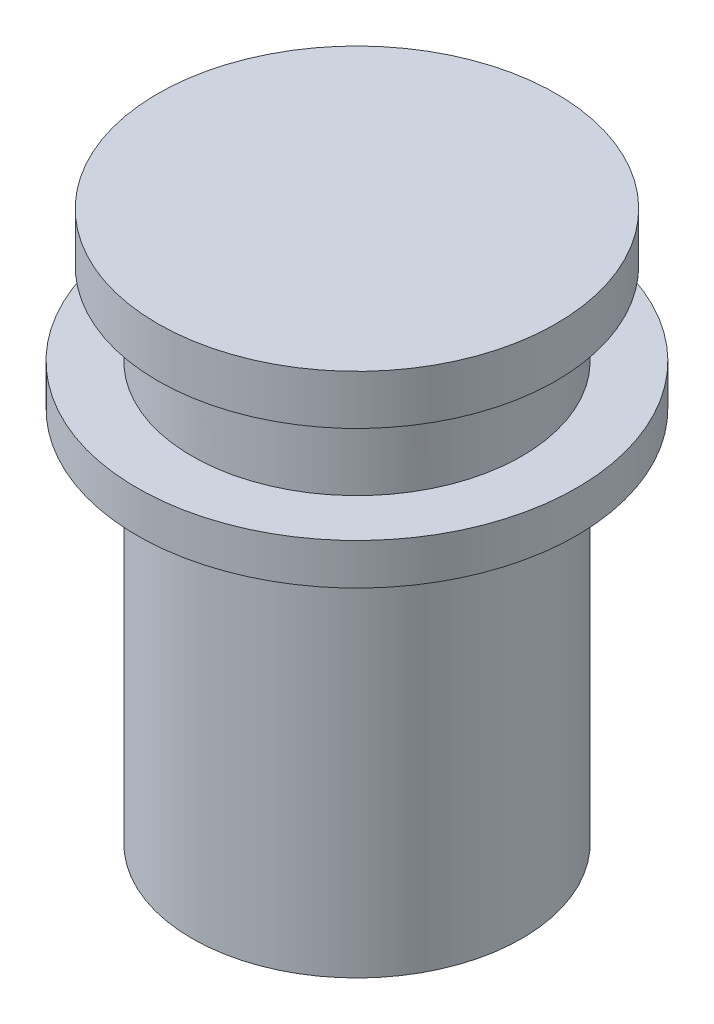
ISO-10303-21;
HEADER;
FILE_DESCRIPTION(('STEP AP214'),'2;1');
FILE_NAME('part.step','',(''),(''),'','','');
FILE_SCHEMA(('AUTOMOTIVE_DESIGN { 1 0 10303 214 1 1 1 1 }'));
ENDSEC;
DATA;
#1=APPLICATION_CONTEXT('core data for automotive mechanical design processes');
#2=APPLICATION_PROTOCOL_DEFINITION('international standard','automotive_design',2000,#1);
#3=PRODUCT_CONTEXT('',#1,'mechanical');
#4=PRODUCT('Part','Part','',(#3));
#5=PRODUCT_RELATED_PRODUCT_CATEGORY('part','',(#4));
#6=PRODUCT_DEFINITION_FORMATION('','',#4);
#7=PRODUCT_DEFINITION_CONTEXT('part definition',#1,'design');
#8=PRODUCT_DEFINITION('design','',#6,#7);
#9=PRODUCT_DEFINITION_SHAPE('','',#8);
#10=(LENGTH_UNIT() NAMED_UNIT(*) SI_UNIT(.MILLI.,.METRE.));
#11=(NAMED_UNIT(*) PLANE_ANGLE_UNIT() SI_UNIT($,.RADIAN.));
#12=(NAMED_UNIT(*) SI_UNIT($,.STERADIAN.) SOLID_ANGLE_UNIT());
#13=UNCERTAINTY_MEASURE_WITH_UNIT(LENGTH_MEASURE(1.E-05),#10,'distance_accuracy_value','');
#14=(GEOMETRIC_REPRESENTATION_CONTEXT(3) GLOBAL_UNCERTAINTY_ASSIGNED_CONTEXT((#13)) GLOBAL_UNIT_ASSIGNED_CONTEXT((#10,
#11,#12)) REPRESENTATION_CONTEXT('',''));
#15=CARTESIAN_POINT('',(0.,0.,0.));
#16=DIRECTION('',(0.,0.,1.));
#17=DIRECTION('',(1.,0.,0.));
#18=AXIS2_PLACEMENT_3D('',#15,#16,#17);
#19=CARTESIAN_POINT('',(0.,18.2,0.));
#20=DIRECTION('',(0.,-1.,0.));
#21=DIRECTION('',(0.,0.,-1.));
#22=AXIS2_PLACEMENT_3D('',#19,#20,#21);
#23=CYLINDRICAL_SURFACE('',#22,6.00000000000001);
#24=CARTESIAN_POINT('',(0.,18.2,0.));
#25=DIRECTION('',(0.,1.,0.));
#26=DIRECTION('',(0.,0.,1.));
#27=AXIS2_PLACEMENT_3D('',#24,#25,#26);
#28=CIRCLE('',#27,6.00000000000001);
#29=CARTESIAN_POINT('',(0.,18.2,6.00000000000001));
#30=VERTEX_POINT('',#29);
#31=EDGE_CURVE('E47',#30,#30,#28,.T.);
#32=ORIENTED_EDGE('',*,*,#31,.F.);
#33=EDGE_LOOP('',(#32));
#34=FACE_BOUND('',#33,.T.);
#35=CARTESIAN_POINT('',(0.,15.2,0.));
#36=DIRECTION('',(0.,-1.,0.));
#37=DIRECTION('',(0.,0.,-1.));
#38=AXIS2_PLACEMENT_3D('',#35,#36,#37);
#39=CIRCLE('',#38,6.00000000000001);
#40=CARTESIAN_POINT('',(0.,15.2,-6.00000000000001));
#41=VERTEX_POINT('',#40);
#42=EDGE_CURVE('E10',#41,#41,#39,.T.);
#43=ORIENTED_EDGE('',*,*,#42,.F.);
#44=EDGE_LOOP('',(#43));
#45=FACE_BOUND('',#44,.T.);
#46=ADVANCED_FACE('F37',(#34,#45),#23,.T.);
#47=CARTESIAN_POINT('',(0.,20.,0.));
#48=DIRECTION('',(0.,-1.,0.));
#49=DIRECTION('',(0.,0.,-1.));
#50=AXIS2_PLACEMENT_3D('',#47,#48,#49);
#51=CYLINDRICAL_SURFACE('',#50,7.25);
#52=CARTESIAN_POINT('',(0.,20.,0.));
#53=DIRECTION('',(0.,1.,0.));
#54=DIRECTION('',(0.,0.,1.));
#55=AXIS2_PLACEMENT_3D('',#52,#53,#54);
#56=CIRCLE('',#55,7.25);
#57=CARTESIAN_POINT('',(0.,20.,7.25));
#58=VERTEX_POINT('',#57);
#59=EDGE_CURVE('E55',#58,#58,#56,.T.);
#60=ORIENTED_EDGE('',*,*,#59,.F.);
#61=EDGE_LOOP('',(#60));
#62=FACE_BOUND('',#61,.T.);
#63=CARTESIAN_POINT('',(0.,18.2,0.));
#64=DIRECTION('',(0.,1.,0.));
#65=DIRECTION('',(0.,0.,1.));
#66=AXIS2_PLACEMENT_3D('',#63,#64,#65);
#67=CIRCLE('',#66,7.25);
#68=CARTESIAN_POINT('',(0.,18.2,7.25));
#69=VERTEX_POINT('',#68);
#70=EDGE_CURVE('E57',#69,#69,#67,.T.);
#71=ORIENTED_EDGE('',*,*,#70,.T.);
#72=EDGE_LOOP('',(#71));
#73=FACE_BOUND('',#72,.T.);
#74=ADVANCED_FACE('F86',(#62,#73),#51,.T.);
#75=CARTESIAN_POINT('',(0.,20.,0.));
#76=DIRECTION('',(0.,1.,0.));
#77=DIRECTION('',(0.,0.,1.));
#78=AXIS2_PLACEMENT_3D('',#75,#76,#77);
#79=PLANE('',#78);
#80=ORIENTED_EDGE('',*,*,#59,.T.);
#81=EDGE_LOOP('',(#80));
#82=FACE_BOUND('',#81,.T.);
#83=ADVANCED_FACE('F82',(#82),#79,.T.);
#84=CARTESIAN_POINT('',(0.,18.2,0.));
#85=DIRECTION('',(0.,1.,0.));
#86=DIRECTION('',(0.,0.,1.));
#87=AXIS2_PLACEMENT_3D('',#84,#85,#86);
#88=PLANE('',#87);
#89=ORIENTED_EDGE('',*,*,#31,.T.);
#90=EDGE_LOOP('',(#89));
#91=FACE_BOUND('',#90,.T.);
#92=ORIENTED_EDGE('',*,*,#70,.F.);
#93=EDGE_LOOP('',(#92));
#94=FACE_BOUND('',#93,.T.);
#95=ADVANCED_FACE('F74',(#91,#94),#88,.F.);
#96=CARTESIAN_POINT('',(0.,15.2,8.00000000000001));
#97=DIRECTION('',(0.,-1.,0.));
#98=DIRECTION('',(0.,0.,-1.));
#99=AXIS2_PLACEMENT_3D('',#96,#97,#98);
#100=PLANE('',#99);
#101=CARTESIAN_POINT('',(0.,15.2,0.));
#102=DIRECTION('',(0.,-1.,0.));
#103=DIRECTION('',(0.,0.,-1.));
#104=AXIS2_PLACEMENT_3D('',#101,#102,#103);
#105=CIRCLE('',#104,8.00000000000001);
#106=CARTESIAN_POINT('',(0.,15.2,-8.00000000000001));
#107=VERTEX_POINT('',#106);
#108=EDGE_CURVE('E65',#107,#107,#105,.T.);
#109=ORIENTED_EDGE('',*,*,#108,.F.);
#110=EDGE_LOOP('',(#109));
#111=FACE_BOUND('',#110,.T.);
#112=ORIENTED_EDGE('',*,*,#42,.T.);
#113=EDGE_LOOP('',(#112));
#114=FACE_BOUND('',#113,.T.);
#115=ADVANCED_FACE('F71',(#111,#114),#100,.F.);
#116=CARTESIAN_POINT('',(0.,13.7,6.00000000000001));
#117=DIRECTION('',(0.,1.,0.));
#118=DIRECTION('',(0.,0.,1.));
#119=AXIS2_PLACEMENT_3D('',#116,#117,#118);
#120=PLANE('',#119);
#121=CARTESIAN_POINT('',(0.,13.7,0.));
#122=DIRECTION('',(0.,1.,0.));
#123=DIRECTION('',(0.,0.,1.));
#124=AXIS2_PLACEMENT_3D('',#121,#122,#123);
#125=CIRCLE('',#124,6.00000000000001);
#126=CARTESIAN_POINT('',(0.,13.7,6.00000000000001));
#127=VERTEX_POINT('',#126);
#128=EDGE_CURVE('E43',#127,#127,#125,.T.);
#129=ORIENTED_EDGE('',*,*,#128,.T.);
#130=EDGE_LOOP('',(#129));
#131=FACE_BOUND('',#130,.T.);
#132=CARTESIAN_POINT('',(0.,13.7,0.));
#133=DIRECTION('',(0.,-1.,0.));
#134=DIRECTION('',(0.,0.,-1.));
#135=AXIS2_PLACEMENT_3D('',#132,#133,#134);
#136=CIRCLE('',#135,8.00000000000001);
#137=CARTESIAN_POINT('',(0.,13.7,-8.00000000000001));
#138=VERTEX_POINT('',#137);
#139=EDGE_CURVE('E60',#138,#138,#136,.T.);
#140=ORIENTED_EDGE('',*,*,#139,.T.);
#141=EDGE_LOOP('',(#140));
#142=FACE_BOUND('',#141,.T.);
#143=ADVANCED_FACE('F73',(#131,#142),#120,.F.);
#144=CARTESIAN_POINT('',(0.,0.,0.));
#145=DIRECTION('',(0.,-1.,0.));
#146=DIRECTION('',(0.,0.,-1.));
#147=AXIS2_PLACEMENT_3D('',#144,#145,#146);
#148=CYLINDRICAL_SURFACE('',#147,8.00000000000001);
#149=ORIENTED_EDGE('',*,*,#139,.F.);
#150=EDGE_LOOP('',(#149));
#151=FACE_BOUND('',#150,.T.);
#152=ORIENTED_EDGE('',*,*,#108,.T.);
#153=EDGE_LOOP('',(#152));
#154=FACE_BOUND('',#153,.T.);
#155=ADVANCED_FACE('F69',(#151,#154),#148,.T.);
#156=CARTESIAN_POINT('',(0.,0.,0.));
#157=DIRECTION('',(0.,1.,0.));
#158=DIRECTION('',(0.,0.,1.));
#159=AXIS2_PLACEMENT_3D('',#156,#157,#158);
#160=PLANE('',#159);
#161=CARTESIAN_POINT('',(0.,0.,0.));
#162=DIRECTION('',(0.,1.,0.));
#163=DIRECTION('',(0.,0.,1.));
#164=AXIS2_PLACEMENT_3D('',#161,#162,#163);
#165=CIRCLE('',#164,6.00000000000001);
#166=CARTESIAN_POINT('',(0.,0.,6.00000000000001));
#167=VERTEX_POINT('',#166);
#168=EDGE_CURVE('E51',#167,#167,#165,.T.);
#169=ORIENTED_EDGE('',*,*,#168,.F.);
#170=EDGE_LOOP('',(#169));
#171=FACE_BOUND('',#170,.T.);
#172=ADVANCED_FACE('F97',(#171),#160,.F.);
#173=ORIENTED_EDGE('',*,*,#168,.T.);
#174=EDGE_LOOP('',(#173));
#175=FACE_BOUND('',#174,.T.);
#176=ORIENTED_EDGE('',*,*,#128,.F.);
#177=EDGE_LOOP('',(#176));
#178=FACE_BOUND('',#177,.T.);
#179=ADVANCED_FACE('F88',(#175,#178),#23,.T.);
#180=CLOSED_SHELL('',(#46,#74,#83,#95,#115,#143,#155,#172,#179));
#181=MANIFOLD_SOLID_BREP('B2',#180);
#182=ADVANCED_BREP_SHAPE_REPRESENTATION('',(#18,#181),#14);
#183=SHAPE_DEFINITION_REPRESENTATION(#9,#182);
ENDSEC;
END-ISO-10303-21;
